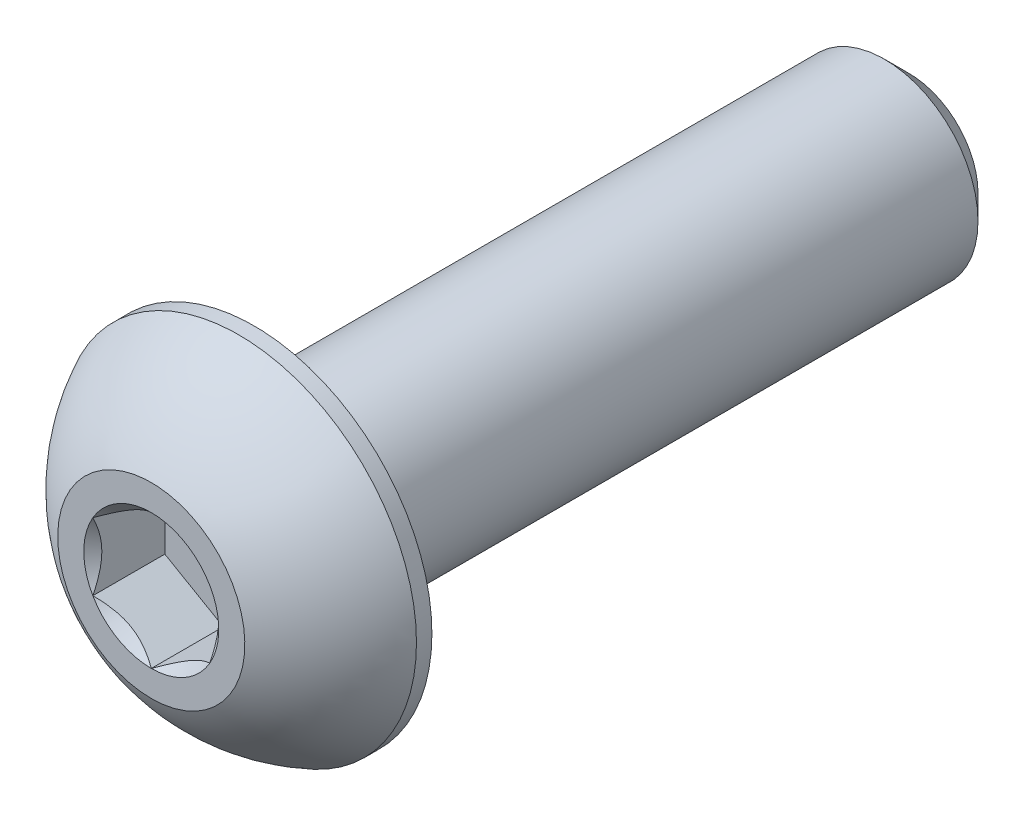
ISO-10303-21;
HEADER;
FILE_DESCRIPTION(('STEP AP214'),'2;1');
FILE_NAME('part.step','',(''),(''),'','','');
FILE_SCHEMA(('AUTOMOTIVE_DESIGN { 1 0 10303 214 1 1 1 1 }'));
ENDSEC;
DATA;
#1=APPLICATION_CONTEXT('core data for automotive mechanical design processes');
#2=APPLICATION_PROTOCOL_DEFINITION('international standard','automotive_design',2000,#1);
#3=PRODUCT_CONTEXT('',#1,'mechanical');
#4=PRODUCT('Part','Part','',(#3));
#5=PRODUCT_RELATED_PRODUCT_CATEGORY('part','',(#4));
#6=PRODUCT_DEFINITION_FORMATION('','',#4);
#7=PRODUCT_DEFINITION_CONTEXT('part definition',#1,'design');
#8=PRODUCT_DEFINITION('design','',#6,#7);
#9=PRODUCT_DEFINITION_SHAPE('','',#8);
#10=(LENGTH_UNIT() NAMED_UNIT(*) SI_UNIT(.MILLI.,.METRE.));
#11=(NAMED_UNIT(*) PLANE_ANGLE_UNIT() SI_UNIT($,.RADIAN.));
#12=(NAMED_UNIT(*) SI_UNIT($,.STERADIAN.) SOLID_ANGLE_UNIT());
#13=UNCERTAINTY_MEASURE_WITH_UNIT(LENGTH_MEASURE(1.E-05),#10,'distance_accuracy_value','');
#14=(GEOMETRIC_REPRESENTATION_CONTEXT(3) GLOBAL_UNCERTAINTY_ASSIGNED_CONTEXT((#13)) GLOBAL_UNIT_ASSIGNED_CONTEXT((#10,
#11,#12)) REPRESENTATION_CONTEXT('',''));
#15=CARTESIAN_POINT('',(0.,0.,0.));
#16=DIRECTION('',(0.,0.,1.));
#17=DIRECTION('',(1.,0.,0.));
#18=AXIS2_PLACEMENT_3D('',#15,#16,#17);
#19=CARTESIAN_POINT('',(0.,0.,-16.2));
#20=DIRECTION('',(0.,0.,1.));
#21=DIRECTION('',(1.,0.,0.));
#22=AXIS2_PLACEMENT_3D('',#19,#20,#21);
#23=PLANE('',#22);
#24=CARTESIAN_POINT('',(0.,0.,-16.2));
#25=DIRECTION('',(0.,0.,1.));
#26=DIRECTION('',(1.,0.,0.));
#27=AXIS2_PLACEMENT_3D('',#24,#25,#26);
#28=CIRCLE('',#27,1.47500000000003);
#29=CARTESIAN_POINT('',(1.47500000000003,0.,-16.2));
#30=VERTEX_POINT('',#29);
#31=EDGE_CURVE('E55',#30,#30,#28,.T.);
#32=ORIENTED_EDGE('',*,*,#31,.F.);
#33=EDGE_LOOP('',(#32));
#34=FACE_BOUND('',#33,.T.);
#35=ADVANCED_FACE('F41',(#34),#23,.F.);
#36=CARTESIAN_POINT('',(0.,0.,-16.2));
#37=DIRECTION('',(0.,0.,1.));
#38=DIRECTION('',(1.,0.,0.));
#39=AXIS2_PLACEMENT_3D('',#36,#37,#38);
#40=CONICAL_SURFACE('',#39,1.47500000000003,0.785398163397435);
#41=CARTESIAN_POINT('',(0.,0.,-15.675));
#42=DIRECTION('',(0.,0.,1.));
#43=DIRECTION('',(1.,0.,0.));
#44=AXIS2_PLACEMENT_3D('',#41,#42,#43);
#45=CIRCLE('',#44,2.00000000000002);
#46=CARTESIAN_POINT('',(2.00000000000002,0.,-15.675));
#47=VERTEX_POINT('',#46);
#48=EDGE_CURVE('E198',#47,#47,#45,.T.);
#49=ORIENTED_EDGE('',*,*,#48,.F.);
#50=EDGE_LOOP('',(#49));
#51=FACE_BOUND('',#50,.T.);
#52=ORIENTED_EDGE('',*,*,#31,.T.);
#53=EDGE_LOOP('',(#52));
#54=FACE_BOUND('',#53,.T.);
#55=ADVANCED_FACE('F205',(#51,#54),#40,.T.);
#56=CARTESIAN_POINT('',(0.,0.,0.));
#57=DIRECTION('',(0.,0.,1.));
#58=DIRECTION('',(1.,0.,0.));
#59=AXIS2_PLACEMENT_3D('',#56,#57,#58);
#60=CYLINDRICAL_SURFACE('',#59,2.00000000000002);
#61=CARTESIAN_POINT('',(0.,0.,-2.2));
#62=DIRECTION('',(0.,0.,1.));
#63=DIRECTION('',(1.,0.,0.));
#64=AXIS2_PLACEMENT_3D('',#61,#62,#63);
#65=CIRCLE('',#64,2.00000000000001);
#66=CARTESIAN_POINT('',(2.00000000000001,0.,-2.2));
#67=VERTEX_POINT('',#66);
#68=EDGE_CURVE('E194',#67,#67,#65,.T.);
#69=ORIENTED_EDGE('',*,*,#68,.F.);
#70=EDGE_LOOP('',(#69));
#71=FACE_BOUND('',#70,.T.);
#72=ORIENTED_EDGE('',*,*,#48,.T.);
#73=EDGE_LOOP('',(#72));
#74=FACE_BOUND('',#73,.T.);
#75=ADVANCED_FACE('F211',(#71,#74),#60,.T.);
#76=CARTESIAN_POINT('',(0.,-3.8,-2.2));
#77=DIRECTION('',(0.,0.,1.));
#78=DIRECTION('',(1.,0.,0.));
#79=AXIS2_PLACEMENT_3D('',#76,#77,#78);
#80=PLANE('',#79);
#81=CARTESIAN_POINT('',(0.,0.,-2.2));
#82=DIRECTION('',(0.,0.,1.));
#83=DIRECTION('',(1.,0.,0.));
#84=AXIS2_PLACEMENT_3D('',#81,#82,#83);
#85=CIRCLE('',#84,3.8);
#86=CARTESIAN_POINT('',(3.8,0.,-2.2));
#87=VERTEX_POINT('',#86);
#88=EDGE_CURVE('E186',#87,#87,#85,.T.);
#89=ORIENTED_EDGE('',*,*,#88,.F.);
#90=EDGE_LOOP('',(#89));
#91=FACE_BOUND('',#90,.T.);
#92=ORIENTED_EDGE('',*,*,#68,.T.);
#93=EDGE_LOOP('',(#92));
#94=FACE_BOUND('',#93,.T.);
#95=ADVANCED_FACE('F216',(#91,#94),#80,.F.);
#96=CARTESIAN_POINT('',(0.,0.,-3.72644385026738));
#97=DIRECTION('',(0.,0.,1.));
#98=DIRECTION('',(0.,-1.,0.));
#99=AXIS2_PLACEMENT_3D('',#96,#97,#98);
#100=SPHERICAL_SURFACE('',#99,4.22922968981299);
#101=CARTESIAN_POINT('',(0.,0.,0.));
#102=DIRECTION('',(0.,0.,1.));
#103=DIRECTION('',(1.,0.,0.));
#104=AXIS2_PLACEMENT_3D('',#101,#102,#103);
#105=CIRCLE('',#104,2.00000000000001);
#106=CARTESIAN_POINT('',(0.,-2.00000000000001,0.));
#107=VERTEX_POINT('',#106);
#108=EDGE_CURVE('E190',#107,#107,#105,.T.);
#109=CARTESIAN_POINT('',(0.,0.,-1.87));
#110=DIRECTION('',(0.,0.,1.));
#111=DIRECTION('',(1.,0.,0.));
#112=AXIS2_PLACEMENT_3D('',#109,#110,#111);
#113=CIRCLE('',#112,3.8);
#114=CARTESIAN_POINT('',(0.,-3.8,-1.87));
#115=VERTEX_POINT('',#114);
#116=EDGE_CURVE('E182',#115,#115,#113,.T.);
#117=CARTESIAN_POINT('',(0.,-2.00000000000001,0.));
#118=CARTESIAN_POINT('',(0.,-2.02421343985615,-0.0129954259644869));
#119=CARTESIAN_POINT('',(0.,-2.04830018323976,-0.0262269129651298));
#120=CARTESIAN_POINT('',(0.,-2.09621120342127,-0.0531568415057489));
#121=CARTESIAN_POINT('',(0.,-2.12003548021918,-0.0668552830457251));
#122=CARTESIAN_POINT('',(0.,-2.16741249358868,-0.0947139531320313));
#123=CARTESIAN_POINT('',(0.,-2.19096523016027,-0.108874181678362));
#124=CARTESIAN_POINT('',(0.,-2.23779021933684,-0.137651035235957));
#125=CARTESIAN_POINT('',(0.,-2.26106247194182,-0.152267660247222));
#126=CARTESIAN_POINT('',(0.,-2.30731764886073,-0.181951755514141));
#127=CARTESIAN_POINT('',(0.,-2.33030057317466,-0.197019225769796));
#128=CARTESIAN_POINT('',(0.,-2.37596836104236,-0.227599285582871));
#129=CARTESIAN_POINT('',(0.,-2.39865322459613,-0.243111875140292));
#130=CARTESIAN_POINT('',(0.,-2.44371627121514,-0.274576279395883));
#131=CARTESIAN_POINT('',(0.,-2.46609445428039,-0.290528094094054));
#132=CARTESIAN_POINT('',(0.,-2.51053563686182,-0.322864887331673));
#133=CARTESIAN_POINT('',(0.,-2.53259863637801,-0.339249865871121));
#134=CARTESIAN_POINT('',(0.,-2.57640106852493,-0.372446760967232));
#135=CARTESIAN_POINT('',(0.,-2.59814050115565,-0.389258677523893));
#136=CARTESIAN_POINT('',(0.,-2.64128753915154,-0.423303060588149));
#137=CARTESIAN_POINT('',(0.,-2.66269514451672,-0.440535527095743));
#138=CARTESIAN_POINT('',(0.,-2.70517039368396,-0.475414462202968));
#139=CARTESIAN_POINT('',(0.,-2.72623803748603,-0.493060930802598));
#140=CARTESIAN_POINT('',(0.,-2.76802535840619,-0.52876116492441));
#141=CARTESIAN_POINT('',(0.,-2.78874503552429,-0.546814930446591));
#142=CARTESIAN_POINT('',(0.,-2.82982855017314,-0.583322898482808));
#143=CARTESIAN_POINT('',(0.,-2.8501923877039,-0.601777100996845));
#144=CARTESIAN_POINT('',(0.,-2.89055648548395,-0.639078930931024));
#145=CARTESIAN_POINT('',(0.,-2.91055674573325,-0.657926558351167));
#146=CARTESIAN_POINT('',(0.,-2.95018608940553,-0.696008076521268));
#147=CARTESIAN_POINT('',(0.,-2.96981517282853,-0.715241967271226));
#148=CARTESIAN_POINT('',(0.,-3.00869470434028,-0.754088703755296));
#149=CARTESIAN_POINT('',(0.,-3.02794515242904,-0.773701549489407));
#150=CARTESIAN_POINT('',(0.,-3.06606009863533,-0.813298743603727));
#151=CARTESIAN_POINT('',(0.,-3.08492459675287,-0.833283091983936));
#152=CARTESIAN_POINT('',(0.,-3.12226047503003,-0.873615697891679));
#153=CARTESIAN_POINT('',(0.,-3.14073185518965,-0.893963955419214));
#154=CARTESIAN_POINT('',(0.,-3.17727447893822,-0.935016647847444));
#155=CARTESIAN_POINT('',(0.,-3.19534572252716,-0.95572108274814));
#156=CARTESIAN_POINT('',(0.,-3.23108120656243,-0.99747826281099));
#157=CARTESIAN_POINT('',(0.,-3.24874544700875,-1.01853100797314));
#158=CARTESIAN_POINT('',(0.,-3.28366021283673,-1.06097680909897));
#159=CARTESIAN_POINT('',(0.,-3.30091073821839,-1.08236986506264));
#160=CARTESIAN_POINT('',(0.,-3.33499151919534,-1.12548815902284));
#161=CARTESIAN_POINT('',(0.,-3.35182177479064,-1.14721339701936));
#162=CARTESIAN_POINT('',(0.,-3.38505562116372,-1.1909878000568));
#163=CARTESIAN_POINT('',(0.,-3.40145921194149,-1.21303696509771));
#164=CARTESIAN_POINT('',(0.,-3.43383349577047,-1.25745084415152));
#165=CARTESIAN_POINT('',(0.,-3.44980418882167,-1.27981555816441));
#166=CARTESIAN_POINT('',(0.,-3.48130660877275,-1.32485203719233));
#167=CARTESIAN_POINT('',(0.,-3.49683833567264,-1.34752380220736));
#168=CARTESIAN_POINT('',(0.,-3.52745692170932,-1.39316576858967));
#169=CARTESIAN_POINT('',(0.,-3.5425437808461,-1.41613596995695));
#170=CARTESIAN_POINT('',(0.,-3.57226689871518,-1.46236608103065));
#171=CARTESIAN_POINT('',(0.,-3.58690315744748,-1.48562599073709));
#172=CARTESIAN_POINT('',(0.,-3.615719513332,-1.5324266802666));
#173=CARTESIAN_POINT('',(0.,-3.62989961048422,-1.55596746008967));
#174=CARTESIAN_POINT('',(0.,-3.65779825442823,-1.6033209453859));
#175=CARTESIAN_POINT('',(0.,-3.67151680122002,-1.62713365085906));
#176=CARTESIAN_POINT('',(0.,-3.69848713452322,-1.67502193787766));
#177=CARTESIAN_POINT('',(0.,-3.71173892103461,-1.6990975194231));
#178=CARTESIAN_POINT('',(0.,-3.73777068821038,-1.74750241579215));
#179=CARTESIAN_POINT('',(0.,-3.75055066887474,-1.77183173061575));
#180=CARTESIAN_POINT('',(0.,-3.77563400658953,-1.82073482944519));
#181=CARTESIAN_POINT('',(0.,-3.78793736363997,-1.84530861345103));
#182=CARTESIAN_POINT('',(0.,-3.8,-1.87));
#183=B_SPLINE_CURVE_WITH_KNOTS('',3,(#117,#118,#119,#120,#121,#122,#123,#124,#125,#126,#127,
#128,#129,#130,#131,#132,#133,#134,#135,#136,#137,#138,#139,#140,#141,#142,#143,#144,#145,#146,
#147,#148,#149,#150,#151,#152,#153,#154,#155,#156,#157,#158,#159,#160,#161,#162,#163,#164,#165,
#166,#167,#168,#169,#170,#171,#172,#173,#174,#175,#176,#177,#178,#179,#180,#181,#182),
.UNSPECIFIED.,.F.,.F.,(4,2,2,2,2,2,2,2,2,2,2,2,2,2,2,2,2,2,2,2,2,2,2,2,2,2,2,2,2,2,2,2,4),(0.,
0.0824398589102638,0.164879717820528,0.247319576730792,0.329759435641056,0.41219929455132,
0.494639153461583,0.577079012371847,0.659518871282112,0.741958730192376,0.82439858910264,
0.906838448012904,0.989278306923168,1.07171816583343,1.1541580247437,1.23659788365396,
1.31903774256422,1.40147760147449,1.48391746038475,1.56635731929502,1.64879717820528,
1.73123703711554,1.81367689602581,1.89611675493607,1.97855661384634,2.0609964727566,
2.14343633166686,2.22587619057713,2.30831604948739,2.39075590839766,2.47319576730792,
2.55563562621818,2.63807548512845),.UNSPECIFIED.);
#184=EDGE_CURVE('BSEAM221',#107,#115,#183,.T.);
#185=ORIENTED_EDGE('',*,*,#108,.F.);
#186=ORIENTED_EDGE('',*,*,#116,.T.);
#187=ORIENTED_EDGE('',*,*,#184,.T.);
#188=ORIENTED_EDGE('',*,*,#184,.F.);
#189=EDGE_LOOP('',(#185,#187,#186,#188));
#190=FACE_BOUND('',#189,.T.);
#191=ADVANCED_FACE('F221',(#190),#100,.T.);
#192=CARTESIAN_POINT('',(0.,-2.00000000000001,0.));
#193=DIRECTION('',(0.,0.,-1.));
#194=DIRECTION('',(-1.,0.,0.));
#195=AXIS2_PLACEMENT_3D('',#192,#193,#194);
#196=PLANE('',#195);
#197=CARTESIAN_POINT('',(0.,0.,0.));
#198=DIRECTION('',(0.,0.,1.));
#199=DIRECTION('',(1.,0.,0.));
#200=AXIS2_PLACEMENT_3D('',#197,#198,#199);
#201=CIRCLE('',#200,1.44337567297406);
#202=CARTESIAN_POINT('',(-1.25,0.721687836487031,0.));
#203=VERTEX_POINT('',#202);
#204=CARTESIAN_POINT('',(-1.25,-0.721687836487033,0.));
#205=VERTEX_POINT('',#204);
#206=EDGE_CURVE('E68',#203,#205,#201,.T.);
#207=ORIENTED_EDGE('',*,*,#206,.F.);
#208=CARTESIAN_POINT('',(0.,1.44337567297406,0.));
#209=VERTEX_POINT('',#208);
#210=EDGE_CURVE('E145',#209,#203,#201,.T.);
#211=ORIENTED_EDGE('',*,*,#210,.F.);
#212=CARTESIAN_POINT('',(1.25,0.721687836487029,0.));
#213=VERTEX_POINT('',#212);
#214=EDGE_CURVE('E140',#213,#209,#201,.T.);
#215=ORIENTED_EDGE('',*,*,#214,.F.);
#216=CARTESIAN_POINT('',(1.25,-0.721687836487029,0.));
#217=VERTEX_POINT('',#216);
#218=EDGE_CURVE('E109',#217,#213,#201,.T.);
#219=ORIENTED_EDGE('',*,*,#218,.F.);
#220=CARTESIAN_POINT('',(0.,-1.44337567297406,0.));
#221=VERTEX_POINT('',#220);
#222=EDGE_CURVE('E100',#221,#217,#201,.T.);
#223=ORIENTED_EDGE('',*,*,#222,.F.);
#224=EDGE_CURVE('E61',#205,#221,#201,.T.);
#225=ORIENTED_EDGE('',*,*,#224,.F.);
#226=EDGE_LOOP('',(#207,#211,#215,#219,#223,#225));
#227=FACE_BOUND('',#226,.T.);
#228=ORIENTED_EDGE('',*,*,#108,.T.);
#229=EDGE_LOOP('',(#228));
#230=FACE_BOUND('',#229,.T.);
#231=ADVANCED_FACE('F137',(#227,#230),#196,.F.);
#232=CARTESIAN_POINT('',(0.,0.,0.));
#233=DIRECTION('',(0.,0.,1.));
#234=DIRECTION('',(1.,0.,0.));
#235=AXIS2_PLACEMENT_3D('',#232,#233,#234);
#236=CYLINDRICAL_SURFACE('',#235,3.8);
#237=ORIENTED_EDGE('',*,*,#116,.F.);
#238=EDGE_LOOP('',(#237));
#239=FACE_BOUND('',#238,.T.);
#240=ORIENTED_EDGE('',*,*,#88,.T.);
#241=EDGE_LOOP('',(#240));
#242=FACE_BOUND('',#241,.T.);
#243=ADVANCED_FACE('F227',(#239,#242),#236,.T.);
#244=CARTESIAN_POINT('',(0.,0.,0.));
#245=DIRECTION('',(0.,0.,1.));
#246=DIRECTION('',(1.,0.,0.));
#247=AXIS2_PLACEMENT_3D('',#244,#245,#246);
#248=CONICAL_SURFACE('',#247,1.44337567297406,0.78539816339745);
#249=ORIENTED_EDGE('',*,*,#218,.T.);
#250=CARTESIAN_POINT('',(1.25,-1.43934010808076,0.462982096892323));
#251=CARTESIAN_POINT('',(1.25,-1.40429313005658,0.436524922632886));
#252=CARTESIAN_POINT('',(1.25,-1.36905087135598,0.410327160354276));
#253=CARTESIAN_POINT('',(1.25,-1.2980965070631,0.358557571839581));
#254=CARTESIAN_POINT('',(1.25,-1.26238428576495,0.332985904356291));
#255=CARTESIAN_POINT('',(1.25,-1.15390111792707,0.257005993689462));
#256=CARTESIAN_POINT('',(1.25,-1.08031646726264,0.207740286189565));
#257=CARTESIAN_POINT('',(1.25,-0.926012322755091,0.111025830263131));
#258=CARTESIAN_POINT('',(1.25,-0.845125318656143,0.0638412989417957));
#259=CARTESIAN_POINT('',(1.25,-0.679311174076599,-0.0224692656095865));
#260=CARTESIAN_POINT('',(1.25,-0.594398891026685,-0.0616224653730992));
#261=CARTESIAN_POINT('',(1.25,-0.466944812460738,-0.109522776311707));
#262=CARTESIAN_POINT('',(1.25,-0.426289985812819,-0.123270510213663));
#263=CARTESIAN_POINT('',(1.25,-0.343998850091265,-0.147502072549456));
#264=CARTESIAN_POINT('',(1.25,-0.30236247361496,-0.157985676130227));
#265=CARTESIAN_POINT('',(1.25,-0.219052696285663,-0.174969838251702));
#266=CARTESIAN_POINT('',(1.25,-0.177393428474498,-0.18153863952863));
#267=CARTESIAN_POINT('',(1.25,-0.0936293693401902,-0.190564946542239));
#268=CARTESIAN_POINT('',(1.25,-0.0515246558543941,-0.193023159002731));
#269=CARTESIAN_POINT('',(1.25,0.0311890576306333,-0.193645937986714));
#270=CARTESIAN_POINT('',(1.25,0.071796962549932,-0.191962883153752));
#271=CARTESIAN_POINT('',(1.25,0.152668636885198,-0.184731729402085));
#272=CARTESIAN_POINT('',(1.25,0.192932338835359,-0.179182889586891));
#273=CARTESIAN_POINT('',(1.25,0.273499879165296,-0.164428963535045));
#274=CARTESIAN_POINT('',(1.25,0.313792180618512,-0.155161824035893));
#275=CARTESIAN_POINT('',(1.25,0.393496413911458,-0.133463821542651));
#276=CARTESIAN_POINT('',(1.25,0.43290841911506,-0.121033223269353));
#277=CARTESIAN_POINT('',(1.25,0.556992735862299,-0.0772206470685609));
#278=CARTESIAN_POINT('',(1.25,0.639898924666086,-0.0408489271240422));
#279=CARTESIAN_POINT('',(1.25,0.801816555499702,0.0400191621783368));
#280=CARTESIAN_POINT('',(1.25,0.880812666325045,0.084544720911988));
#281=CARTESIAN_POINT('',(1.25,1.0317856127975,0.176404876666627));
#282=CARTESIAN_POINT('',(1.25,1.10391618485086,0.223489933916251));
#283=CARTESIAN_POINT('',(1.25,1.21018606043311,0.29627856159854));
#284=CARTESIAN_POINT('',(1.25,1.24515069969379,0.32079808539336));
#285=CARTESIAN_POINT('',(1.25,1.31460220852737,0.370485636765682));
#286=CARTESIAN_POINT('',(1.25,1.34908920596618,0.395653485415522));
#287=CARTESIAN_POINT('',(1.25,1.38337731682912,0.421090148841215));
#288=B_SPLINE_CURVE_WITH_KNOTS('',3,(#250,#251,#252,#253,#254,#255,#256,#257,#258,#259,#260,
#261,#262,#263,#264,#265,#266,#267,#268,#269,#270,#271,#272,#273,#274,#275,#276,#277,#278,#279,
#280,#281,#282,#283,#284,#285,#286,#287),.UNSPECIFIED.,.F.,.F.,(4,2,2,2,2,2,2,2,2,2,2,2,2,2,2,2,
2,2,4),(0.,0.131732960381447,0.263498984161643,0.529042014455823,0.809741926134614,
1.08947609717225,1.21811634272576,1.346765447839,1.47310084517843,1.59941451973784,
1.72115042167849,1.84290966131734,1.96679153905341,2.09066305366038,2.36146692896008,
2.6332598919849,2.89154668212278,3.01965734507712,3.14773302245627),.UNSPECIFIED.);
#289=EDGE_CURVE('E11',#217,#213,#288,.T.);
#290=ORIENTED_EDGE('',*,*,#289,.F.);
#291=EDGE_LOOP('',(#249,#290));
#292=FACE_BOUND('',#291,.T.);
#293=ADVANCED_FACE('F113',(#292),#248,.F.);
#294=ORIENTED_EDGE('',*,*,#214,.T.);
#295=CARTESIAN_POINT('',(1.2502,0.721572366433193,0.000115483909137106));
#296=CARTESIAN_POINT('',(1.20722483292841,0.746384090710443,-0.0246783319448953));
#297=CARTESIAN_POINT('',(1.16353099525405,0.771610739653663,-0.0480162655813155));
#298=CARTESIAN_POINT('',(1.07443406915806,0.823050873919154,-0.0907479959154626));
#299=CARTESIAN_POINT('',(1.02902250164294,0.849269254648332,-0.110118007639585));
#300=CARTESIAN_POINT('',(0.93745217906474,0.902137405038635,-0.143299516586522));
#301=CARTESIAN_POINT('',(0.891316759824114,0.928773701756386,-0.157194440947344));
#302=CARTESIAN_POINT('',(0.798029919592407,0.982632884076012,-0.178602717839361));
#303=CARTESIAN_POINT('',(0.75088135086362,1.00985412292348,-0.186132058433213));
#304=CARTESIAN_POINT('',(0.669626443112747,1.05676666578643,-0.192925501949297));
#305=CARTESIAN_POINT('',(0.635625123372058,1.07639733689152,-0.19393144089565));
#306=CARTESIAN_POINT('',(0.567682235567522,1.11562418145499,-0.192238585088681));
#307=CARTESIAN_POINT('',(0.533740682344342,1.1352203463451,-0.189538972784461));
#308=CARTESIAN_POINT('',(0.4661851435425,1.1742235548576,-0.180591069683622));
#309=CARTESIAN_POINT('',(0.432571492713225,1.19363040521232,-0.174339474100294));
#310=CARTESIAN_POINT('',(0.365905361782186,1.23212011385119,-0.158624318586096));
#311=CARTESIAN_POINT('',(0.332853128969704,1.2512028293628,-0.149159379912542));
#312=CARTESIAN_POINT('',(0.248200308399735,1.30007715810653,-0.121068609312414));
#313=CARTESIAN_POINT('',(0.197133507570362,1.32956058931202,-0.100329842547799));
#314=CARTESIAN_POINT('',(0.0969991458867455,1.38737318998519,-0.0536128653285237));
#315=CARTESIAN_POINT('',(0.0479256884217311,1.41570576386268,-0.0276517040532341));
#316=CARTESIAN_POINT('',(-0.000199999999999383,1.4434911430279,0.000115483909135572));
#317=B_SPLINE_CURVE_WITH_KNOTS('',3,(#295,#296,#297,#298,#299,#300,#301,#302,#303,#304,#305,
#306,#307,#308,#309,#310,#311,#312,#313,#314,#315,#316),.UNSPECIFIED.,.F.,.F.,(4,2,2,2,2,2,2,2,
2,2,4),(0.,0.166533409618304,0.334037607289762,0.498880396489699,0.663307919240276,
0.780963963458828,0.898645970148454,1.01643764860773,1.1342799317155,1.32148652032141,
1.50809158792573),.UNSPECIFIED.);
#318=EDGE_CURVE('E144',#213,#209,#317,.T.);
#319=ORIENTED_EDGE('',*,*,#318,.F.);
#320=EDGE_LOOP('',(#294,#319));
#321=FACE_BOUND('',#320,.T.);
#322=ADVANCED_FACE('F323',(#321),#248,.F.);
#323=ORIENTED_EDGE('',*,*,#210,.T.);
#324=CARTESIAN_POINT('',(0.000200000000000433,1.4434911430279,0.000115483909135892));
#325=CARTESIAN_POINT('',(-0.0427751670715862,1.41867941875065,-0.0246783319448965));
#326=CARTESIAN_POINT('',(-0.0864690047459474,1.39345276980743,-0.0480162655813166));
#327=CARTESIAN_POINT('',(-0.175565930841941,1.34201263554194,-0.0907479959154634));
#328=CARTESIAN_POINT('',(-0.220977498357063,1.31579425481276,-0.110118007639586));
#329=CARTESIAN_POINT('',(-0.312547820935259,1.26292610442246,-0.143299516586523));
#330=CARTESIAN_POINT('',(-0.358683240175885,1.23628980770471,-0.157194440947344));
#331=CARTESIAN_POINT('',(-0.451970080407591,1.18243062538508,-0.178602717839361));
#332=CARTESIAN_POINT('',(-0.499118649136379,1.15520938653761,-0.186132058433213));
#333=CARTESIAN_POINT('',(-0.580373556887251,1.10829684367467,-0.192925501949298));
#334=CARTESIAN_POINT('',(-0.61437487662794,1.08866617256958,-0.193931440895651));
#335=CARTESIAN_POINT('',(-0.682317764432476,1.04943932800611,-0.192238585088682));
#336=CARTESIAN_POINT('',(-0.716259317655656,1.02984316311599,-0.189538972784462));
#337=CARTESIAN_POINT('',(-0.783814856457498,0.990839954603498,-0.180591069683623));
#338=CARTESIAN_POINT('',(-0.817428507286774,0.97143310424877,-0.174339474100295));
#339=CARTESIAN_POINT('',(-0.884094638217812,0.932943395609904,-0.158624318586097));
#340=CARTESIAN_POINT('',(-0.917146871030294,0.913860680098299,-0.149159379912542));
#341=CARTESIAN_POINT('',(-1.00179969160026,0.864986351354567,-0.121068609312415));
#342=CARTESIAN_POINT('',(-1.05286649242964,0.835502920149075,-0.1003298425478));
#343=CARTESIAN_POINT('',(-1.15300085411325,0.777690319475907,-0.0536128653285245));
#344=CARTESIAN_POINT('',(-1.20207431157827,0.749357745598416,-0.0276517040532348));
#345=CARTESIAN_POINT('',(-1.2502,0.721572366433194,0.000115483909135054));
#346=B_SPLINE_CURVE_WITH_KNOTS('',3,(#324,#325,#326,#327,#328,#329,#330,#331,#332,#333,#334,
#335,#336,#337,#338,#339,#340,#341,#342,#343,#344,#345),.UNSPECIFIED.,.F.,.F.,(4,2,2,2,2,2,2,2,
2,2,4),(0.,0.166533409618303,0.334037607289761,0.498880396489697,0.663307919240274,
0.780963963458826,0.898645970148452,1.01643764860773,1.13427993171549,1.32148652032141,
1.50809158792573),.UNSPECIFIED.);
#347=EDGE_CURVE('E151',#209,#203,#346,.T.);
#348=ORIENTED_EDGE('',*,*,#347,.F.);
#349=EDGE_LOOP('',(#323,#348));
#350=FACE_BOUND('',#349,.T.);
#351=ADVANCED_FACE('F156',(#350),#248,.F.);
#352=ORIENTED_EDGE('',*,*,#206,.T.);
#353=CARTESIAN_POINT('',(-1.25,-1.43934010808077,0.462982096892325));
#354=CARTESIAN_POINT('',(-1.25,-1.40429313005658,0.436524922632887));
#355=CARTESIAN_POINT('',(-1.25,-1.36905087135599,0.410327160354277));
#356=CARTESIAN_POINT('',(-1.25,-1.29809650706311,0.358557571839583));
#357=CARTESIAN_POINT('',(-1.25,-1.26238428576495,0.332985904356292));
#358=CARTESIAN_POINT('',(-1.25,-1.15390111792708,0.257005993689462));
#359=CARTESIAN_POINT('',(-1.25,-1.08031646726264,0.207740286189565));
#360=CARTESIAN_POINT('',(-1.25,-0.926012322755094,0.11102583026313));
#361=CARTESIAN_POINT('',(-1.25,-0.845125318656146,0.0638412989417953));
#362=CARTESIAN_POINT('',(-1.25,-0.679311174076601,-0.0224692656095875));
#363=CARTESIAN_POINT('',(-1.25,-0.594398891026687,-0.0616224653731005));
#364=CARTESIAN_POINT('',(-1.25,-0.46694481246074,-0.109522776311709));
#365=CARTESIAN_POINT('',(-1.25,-0.426289985812821,-0.123270510213665));
#366=CARTESIAN_POINT('',(-1.25,-0.343998850091267,-0.147502072549458));
#367=CARTESIAN_POINT('',(-1.25,-0.302362473614962,-0.157985676130229));
#368=CARTESIAN_POINT('',(-1.25,-0.219052696285665,-0.174969838251704));
#369=CARTESIAN_POINT('',(-1.25,-0.1773934284745,-0.181538639528632));
#370=CARTESIAN_POINT('',(-1.25,-0.0936293693401922,-0.190564946542242));
#371=CARTESIAN_POINT('',(-1.25,-0.051524655854396,-0.193023159002733));
#372=CARTESIAN_POINT('',(-1.25,0.0311890576306315,-0.193645937986716));
#373=CARTESIAN_POINT('',(-1.25,0.0717969625499304,-0.191962883153754));
#374=CARTESIAN_POINT('',(-1.25,0.152668636885197,-0.184731729402088));
#375=CARTESIAN_POINT('',(-1.25,0.192932338835358,-0.179182889586893));
#376=CARTESIAN_POINT('',(-1.25,0.273499879165295,-0.164428963535048));
#377=CARTESIAN_POINT('',(-1.25,0.313792180618511,-0.155161824035896));
#378=CARTESIAN_POINT('',(-1.25,0.393496413911457,-0.133463821542654));
#379=CARTESIAN_POINT('',(-1.25,0.432908419115058,-0.121033223269356));
#380=CARTESIAN_POINT('',(-1.25,0.556992735862297,-0.0772206470685636));
#381=CARTESIAN_POINT('',(-1.25,0.639898924666085,-0.0408489271240449));
#382=CARTESIAN_POINT('',(-1.25,0.8018165554997,0.040019162178334));
#383=CARTESIAN_POINT('',(-1.25,0.880812666325043,0.084544720911985));
#384=CARTESIAN_POINT('',(-1.25,1.0317856127975,0.176404876666624));
#385=CARTESIAN_POINT('',(-1.25,1.10391618485086,0.223489933916248));
#386=CARTESIAN_POINT('',(-1.25,1.2101860604331,0.296278561598537));
#387=CARTESIAN_POINT('',(-1.25,1.24515069969379,0.320798085393357));
#388=CARTESIAN_POINT('',(-1.25,1.31460220852736,0.370485636765679));
#389=CARTESIAN_POINT('',(-1.25,1.34908920596618,0.395653485415518));
#390=CARTESIAN_POINT('',(-1.25,1.38337731682911,0.421090148841212));
#391=B_SPLINE_CURVE_WITH_KNOTS('',3,(#353,#354,#355,#356,#357,#358,#359,#360,#361,#362,#363,
#364,#365,#366,#367,#368,#369,#370,#371,#372,#373,#374,#375,#376,#377,#378,#379,#380,#381,#382,
#383,#384,#385,#386,#387,#388,#389,#390),.UNSPECIFIED.,.F.,.F.,(4,2,2,2,2,2,2,2,2,2,2,2,2,2,2,2,
2,2,4),(0.,0.131732960381448,0.263498984161644,0.529042014455824,0.809741926134617,
1.08947609717225,1.21811634272576,1.346765447839,1.47310084517844,1.59941451973784,
1.72115042167849,1.84290966131735,1.96679153905341,2.09066305366039,2.36146692896009,
2.63325989198491,2.89154668212279,3.01965734507712,3.14773302245628),.UNSPECIFIED.);
#392=EDGE_CURVE('E161',#203,#205,#391,.F.);
#393=ORIENTED_EDGE('',*,*,#392,.F.);
#394=EDGE_LOOP('',(#352,#393));
#395=FACE_BOUND('',#394,.T.);
#396=ADVANCED_FACE('F317',(#395),#248,.F.);
#397=ORIENTED_EDGE('',*,*,#224,.T.);
#398=CARTESIAN_POINT('',(-1.2502,-0.721572366433194,0.000115483909134937));
#399=CARTESIAN_POINT('',(-1.20722483292841,-0.746384090710444,-0.0246783319448973));
#400=CARTESIAN_POINT('',(-1.16353099525405,-0.771610739653664,-0.0480162655813174));
#401=CARTESIAN_POINT('',(-1.07443406915806,-0.823050873919154,-0.0907479959154642));
#402=CARTESIAN_POINT('',(-1.02902250164293,-0.849269254648332,-0.110118007639587));
#403=CARTESIAN_POINT('',(-0.937452179064738,-0.902137405038635,-0.143299516586524));
#404=CARTESIAN_POINT('',(-0.891316759824113,-0.928773701756386,-0.157194440947345));
#405=CARTESIAN_POINT('',(-0.798029919592406,-0.982632884076012,-0.178602717839362));
#406=CARTESIAN_POINT('',(-0.750881350863619,-1.00985412292348,-0.186132058433214));
#407=CARTESIAN_POINT('',(-0.669626443112746,-1.05676666578643,-0.192925501949298));
#408=CARTESIAN_POINT('',(-0.635625123372058,-1.07639733689152,-0.193931440895651));
#409=CARTESIAN_POINT('',(-0.567682235567521,-1.11562418145499,-0.192238585088682));
#410=CARTESIAN_POINT('',(-0.533740682344341,-1.1352203463451,-0.189538972784462));
#411=CARTESIAN_POINT('',(-0.466185143542499,-1.1742235548576,-0.180591069683623));
#412=CARTESIAN_POINT('',(-0.432571492713224,-1.19363040521232,-0.174339474100295));
#413=CARTESIAN_POINT('',(-0.365905361782186,-1.23212011385119,-0.158624318586096));
#414=CARTESIAN_POINT('',(-0.332853128969703,-1.25120282936279,-0.149159379912542));
#415=CARTESIAN_POINT('',(-0.248200308399735,-1.30007715810653,-0.121068609312415));
#416=CARTESIAN_POINT('',(-0.197133507570361,-1.32956058931202,-0.1003298425478));
#417=CARTESIAN_POINT('',(-0.0969991458867451,-1.38737318998519,-0.0536128653285245));
#418=CARTESIAN_POINT('',(-0.0479256884217308,-1.41570576386268,-0.0276517040532348));
#419=CARTESIAN_POINT('',(0.000199999999999627,-1.4434911430279,0.000115483909135029));
#420=B_SPLINE_CURVE_WITH_KNOTS('',3,(#398,#399,#400,#401,#402,#403,#404,#405,#406,#407,#408,
#409,#410,#411,#412,#413,#414,#415,#416,#417,#418,#419),.UNSPECIFIED.,.F.,.F.,(4,2,2,2,2,2,2,2,
2,2,4),(0.,0.166533409618303,0.334037607289761,0.498880396489697,0.663307919240273,
0.780963963458825,0.898645970148451,1.01643764860773,1.13427993171549,1.32148652032141,
1.50809158792573),.UNSPECIFIED.);
#421=EDGE_CURVE('E126',#205,#221,#420,.T.);
#422=ORIENTED_EDGE('',*,*,#421,.F.);
#423=EDGE_LOOP('',(#397,#422));
#424=FACE_BOUND('',#423,.T.);
#425=ADVANCED_FACE('F256',(#424),#248,.F.);
#426=ORIENTED_EDGE('',*,*,#222,.T.);
#427=CARTESIAN_POINT('',(-0.000200000000000326,-1.4434911430279,0.000115483909135025));
#428=CARTESIAN_POINT('',(0.0427751670715863,-1.41867941875065,-0.0246783319448973));
#429=CARTESIAN_POINT('',(0.0864690047459475,-1.39345276980743,-0.0480162655813174));
#430=CARTESIAN_POINT('',(0.175565930841941,-1.34201263554194,-0.0907479959154642));
#431=CARTESIAN_POINT('',(0.220977498357063,-1.31579425481276,-0.110118007639587));
#432=CARTESIAN_POINT('',(0.312547820935259,-1.26292610442246,-0.143299516586524));
#433=CARTESIAN_POINT('',(0.358683240175885,-1.23628980770471,-0.157194440947345));
#434=CARTESIAN_POINT('',(0.451970080407591,-1.18243062538508,-0.178602717839362));
#435=CARTESIAN_POINT('',(0.499118649136378,-1.15520938653761,-0.186132058433214));
#436=CARTESIAN_POINT('',(0.580373556887251,-1.10829684367467,-0.192925501949298));
#437=CARTESIAN_POINT('',(0.614374876627939,-1.08866617256958,-0.193931440895651));
#438=CARTESIAN_POINT('',(0.682317764432476,-1.04943932800611,-0.192238585088682));
#439=CARTESIAN_POINT('',(0.716259317655656,-1.02984316311599,-0.189538972784463));
#440=CARTESIAN_POINT('',(0.783814856457498,-0.990839954603497,-0.180591069683624));
#441=CARTESIAN_POINT('',(0.817428507286773,-0.971433104248769,-0.174339474100296));
#442=CARTESIAN_POINT('',(0.884094638217811,-0.932943395609904,-0.158624318586097));
#443=CARTESIAN_POINT('',(0.917146871030293,-0.913860680098299,-0.149159379912543));
#444=CARTESIAN_POINT('',(1.00179969160026,-0.864986351354566,-0.121068609312415));
#445=CARTESIAN_POINT('',(1.05286649242964,-0.835502920149074,-0.100329842547801));
#446=CARTESIAN_POINT('',(1.15300085411325,-0.777690319475906,-0.0536128653285243));
#447=CARTESIAN_POINT('',(1.20207431157827,-0.749357745598414,-0.0276517040532342));
#448=CARTESIAN_POINT('',(1.2502,-0.721572366433191,0.00011548390913593));
#449=B_SPLINE_CURVE_WITH_KNOTS('',3,(#427,#428,#429,#430,#431,#432,#433,#434,#435,#436,#437,
#438,#439,#440,#441,#442,#443,#444,#445,#446,#447,#448),.UNSPECIFIED.,.F.,.F.,(4,2,2,2,2,2,2,2,
2,2,4),(0.,0.166533409618303,0.334037607289761,0.498880396489697,0.663307919240273,
0.780963963458825,0.898645970148451,1.01643764860773,1.13427993171549,1.32148652032141,
1.50809158792574),.UNSPECIFIED.);
#450=EDGE_CURVE('E104',#221,#217,#449,.T.);
#451=ORIENTED_EDGE('',*,*,#450,.F.);
#452=EDGE_LOOP('',(#426,#451));
#453=FACE_BOUND('',#452,.T.);
#454=ADVANCED_FACE('F102',(#453),#248,.F.);
#455=CARTESIAN_POINT('',(1.25,-0.721687836487029,-1.54));
#456=DIRECTION('',(0.,0.,1.));
#457=DIRECTION('',(1.,0.,0.));
#458=AXIS2_PLACEMENT_3D('',#455,#456,#457);
#459=PLANE('',#458);
#460=DIRECTION('',(0.866025403784438,0.5,0.));
#461=VECTOR('',#460,1.);
#462=CARTESIAN_POINT('',(0.,-1.44337567297406,-1.54));
#463=LINE('',#462,#461);
#464=CARTESIAN_POINT('',(0.,-1.44337567297406,-1.54));
#465=VERTEX_POINT('',#464);
#466=CARTESIAN_POINT('',(1.25,-0.721687836487029,-1.54));
#467=VERTEX_POINT('',#466);
#468=EDGE_CURVE('E125',#465,#467,#463,.T.);
#469=ORIENTED_EDGE('',*,*,#468,.T.);
#470=DIRECTION('',(0.,1.,0.));
#471=VECTOR('',#470,1.);
#472=CARTESIAN_POINT('',(1.25,-0.721687836487029,-1.54));
#473=LINE('',#472,#471);
#474=CARTESIAN_POINT('',(1.25,0.721687836487031,-1.54));
#475=VERTEX_POINT('',#474);
#476=EDGE_CURVE('E130',#467,#475,#473,.T.);
#477=ORIENTED_EDGE('',*,*,#476,.T.);
#478=DIRECTION('',(-0.866025403784439,0.5,0.));
#479=VECTOR('',#478,1.);
#480=CARTESIAN_POINT('',(1.25,0.721687836487031,-1.54));
#481=LINE('',#480,#479);
#482=CARTESIAN_POINT('',(0.,1.44337567297406,-1.54));
#483=VERTEX_POINT('',#482);
#484=EDGE_CURVE('E301',#475,#483,#481,.T.);
#485=ORIENTED_EDGE('',*,*,#484,.T.);
#486=DIRECTION('',(-0.866025403784439,-0.5,0.));
#487=VECTOR('',#486,1.);
#488=CARTESIAN_POINT('',(0.,1.44337567297406,-1.54));
#489=LINE('',#488,#487);
#490=CARTESIAN_POINT('',(-1.25,0.721687836487031,-1.54));
#491=VERTEX_POINT('',#490);
#492=EDGE_CURVE('E170',#483,#491,#489,.T.);
#493=ORIENTED_EDGE('',*,*,#492,.T.);
#494=DIRECTION('',(0.,-1.,0.));
#495=VECTOR('',#494,1.);
#496=CARTESIAN_POINT('',(-1.25,0.721687836487031,-1.54));
#497=LINE('',#496,#495);
#498=CARTESIAN_POINT('',(-1.25,-0.721687836487032,-1.54));
#499=VERTEX_POINT('',#498);
#500=EDGE_CURVE('E307',#491,#499,#497,.T.);
#501=ORIENTED_EDGE('',*,*,#500,.T.);
#502=DIRECTION('',(0.866025403784439,-0.5,0.));
#503=VECTOR('',#502,1.);
#504=CARTESIAN_POINT('',(-1.25,-0.721687836487032,-1.54));
#505=LINE('',#504,#503);
#506=EDGE_CURVE('E134',#499,#465,#505,.T.);
#507=ORIENTED_EDGE('',*,*,#506,.T.);
#508=EDGE_LOOP('',(#469,#477,#485,#493,#501,#507));
#509=FACE_BOUND('',#508,.T.);
#510=ADVANCED_FACE('F255',(#509),#459,.T.);
#511=CARTESIAN_POINT('',(1.25,-0.721687836487029,-1.54));
#512=DIRECTION('',(1.,0.,0.));
#513=DIRECTION('',(0.,0.,-1.));
#514=AXIS2_PLACEMENT_3D('',#511,#512,#513);
#515=PLANE('',#514);
#516=DIRECTION('',(0.,0.,1.));
#517=VECTOR('',#516,1.);
#518=CARTESIAN_POINT('',(1.25,-0.721687836487029,-1.54));
#519=LINE('',#518,#517);
#520=EDGE_CURVE('E121',#467,#217,#519,.T.);
#521=ORIENTED_EDGE('',*,*,#520,.T.);
#522=ORIENTED_EDGE('',*,*,#289,.T.);
#523=DIRECTION('',(0.,0.,1.));
#524=VECTOR('',#523,1.);
#525=CARTESIAN_POINT('',(1.25,0.721687836487031,-1.54));
#526=LINE('',#525,#524);
#527=EDGE_CURVE('E133',#475,#213,#526,.T.);
#528=ORIENTED_EDGE('',*,*,#527,.F.);
#529=ORIENTED_EDGE('',*,*,#476,.F.);
#530=EDGE_LOOP('',(#521,#522,#528,#529));
#531=FACE_BOUND('',#530,.T.);
#532=ADVANCED_FACE('F128',(#531),#515,.F.);
#533=CARTESIAN_POINT('',(1.25,0.721687836487031,-1.54));
#534=DIRECTION('',(0.5,0.866025403784439,0.));
#535=DIRECTION('',(-0.866025403784439,0.5,0.));
#536=AXIS2_PLACEMENT_3D('',#533,#534,#535);
#537=PLANE('',#536);
#538=ORIENTED_EDGE('',*,*,#527,.T.);
#539=ORIENTED_EDGE('',*,*,#318,.T.);
#540=DIRECTION('',(0.,0.,1.));
#541=VECTOR('',#540,1.);
#542=CARTESIAN_POINT('',(0.,1.44337567297406,-1.54));
#543=LINE('',#542,#541);
#544=EDGE_CURVE('E166',#483,#209,#543,.T.);
#545=ORIENTED_EDGE('',*,*,#544,.F.);
#546=ORIENTED_EDGE('',*,*,#484,.F.);
#547=EDGE_LOOP('',(#538,#539,#545,#546));
#548=FACE_BOUND('',#547,.T.);
#549=ADVANCED_FACE('F164',(#548),#537,.F.);
#550=CARTESIAN_POINT('',(0.,1.44337567297406,-1.54));
#551=DIRECTION('',(-0.5,0.866025403784438,0.));
#552=DIRECTION('',(-0.866025403784439,-0.5,0.));
#553=AXIS2_PLACEMENT_3D('',#550,#551,#552);
#554=PLANE('',#553);
#555=ORIENTED_EDGE('',*,*,#544,.T.);
#556=ORIENTED_EDGE('',*,*,#347,.T.);
#557=DIRECTION('',(0.,0.,1.));
#558=VECTOR('',#557,1.);
#559=CARTESIAN_POINT('',(-1.25,0.721687836487031,-1.54));
#560=LINE('',#559,#558);
#561=EDGE_CURVE('E173',#491,#203,#560,.T.);
#562=ORIENTED_EDGE('',*,*,#561,.F.);
#563=ORIENTED_EDGE('',*,*,#492,.F.);
#564=EDGE_LOOP('',(#555,#556,#562,#563));
#565=FACE_BOUND('',#564,.T.);
#566=ADVANCED_FACE('F168',(#565),#554,.F.);
#567=CARTESIAN_POINT('',(-1.25,0.721687836487031,-1.54));
#568=DIRECTION('',(-1.,0.,0.));
#569=DIRECTION('',(0.,-1.,0.));
#570=AXIS2_PLACEMENT_3D('',#567,#568,#569);
#571=PLANE('',#570);
#572=ORIENTED_EDGE('',*,*,#561,.T.);
#573=ORIENTED_EDGE('',*,*,#392,.T.);
#574=DIRECTION('',(0.,0.,1.));
#575=VECTOR('',#574,1.);
#576=CARTESIAN_POINT('',(-1.25,-0.721687836487032,-1.54));
#577=LINE('',#576,#575);
#578=EDGE_CURVE('E177',#499,#205,#577,.T.);
#579=ORIENTED_EDGE('',*,*,#578,.F.);
#580=ORIENTED_EDGE('',*,*,#500,.F.);
#581=EDGE_LOOP('',(#572,#573,#579,#580));
#582=FACE_BOUND('',#581,.T.);
#583=ADVANCED_FACE('F278',(#582),#571,.F.);
#584=CARTESIAN_POINT('',(-1.25,-0.721687836487032,-1.54));
#585=DIRECTION('',(-0.5,-0.866025403784439,0.));
#586=DIRECTION('',(0.866025403784439,-0.5,0.));
#587=AXIS2_PLACEMENT_3D('',#584,#585,#586);
#588=PLANE('',#587);
#589=ORIENTED_EDGE('',*,*,#578,.T.);
#590=ORIENTED_EDGE('',*,*,#421,.T.);
#591=DIRECTION('',(0.,0.,1.));
#592=VECTOR('',#591,1.);
#593=CARTESIAN_POINT('',(0.,-1.44337567297406,-1.54));
#594=LINE('',#593,#592);
#595=EDGE_CURVE('E123',#465,#221,#594,.T.);
#596=ORIENTED_EDGE('',*,*,#595,.F.);
#597=ORIENTED_EDGE('',*,*,#506,.F.);
#598=EDGE_LOOP('',(#589,#590,#596,#597));
#599=FACE_BOUND('',#598,.T.);
#600=ADVANCED_FACE('F236',(#599),#588,.F.);
#601=CARTESIAN_POINT('',(0.,-1.44337567297406,-1.54));
#602=DIRECTION('',(0.5,-0.866025403784438,0.));
#603=DIRECTION('',(0.866025403784439,0.5,0.));
#604=AXIS2_PLACEMENT_3D('',#601,#602,#603);
#605=PLANE('',#604);
#606=ORIENTED_EDGE('',*,*,#595,.T.);
#607=ORIENTED_EDGE('',*,*,#450,.T.);
#608=ORIENTED_EDGE('',*,*,#520,.F.);
#609=ORIENTED_EDGE('',*,*,#468,.F.);
#610=EDGE_LOOP('',(#606,#607,#608,#609));
#611=FACE_BOUND('',#610,.T.);
#612=ADVANCED_FACE('F119',(#611),#605,.F.);
#613=CLOSED_SHELL('',(#35,#55,#75,#95,#191,#231,#243,#293,#322,#351,#396,#425,#454,#510,#532,
#549,#566,#583,#600,#612));
#614=MANIFOLD_SOLID_BREP('B2',#613);
#615=ADVANCED_BREP_SHAPE_REPRESENTATION('',(#18,#614),#14);
#616=SHAPE_DEFINITION_REPRESENTATION(#9,#615);
ENDSEC;
END-ISO-10303-21;
